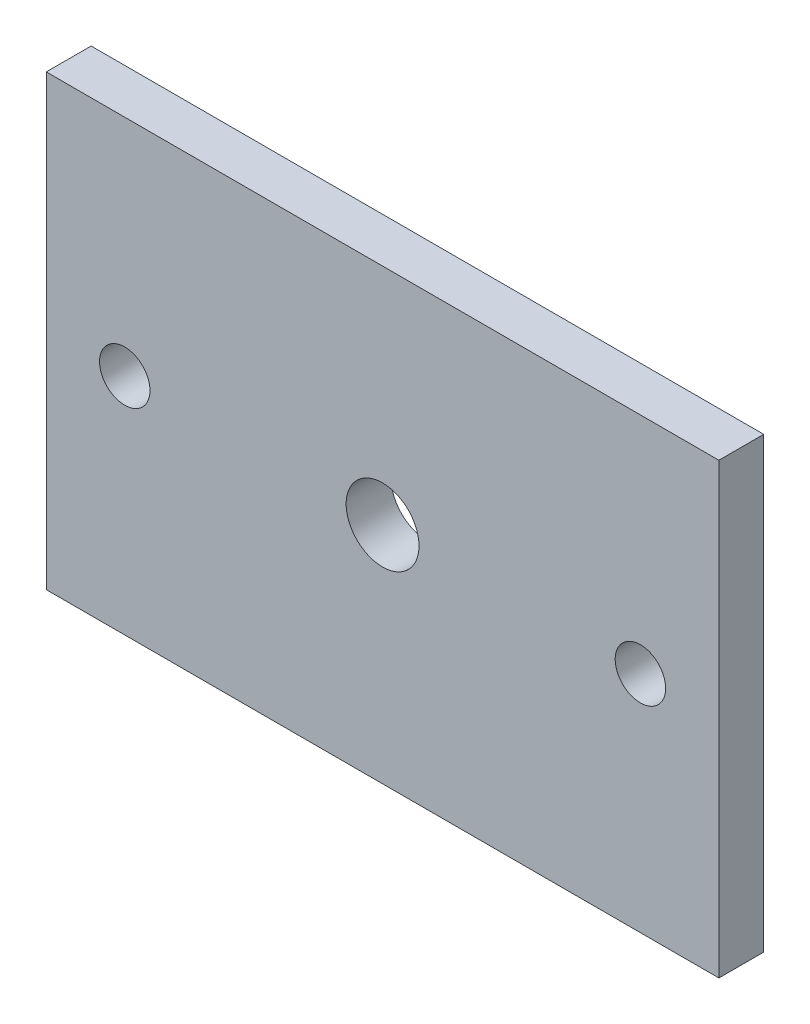
ISO-10303-21;
HEADER;
FILE_DESCRIPTION(('STEP AP214'),'2;1');
FILE_NAME('part.step','',(''),(''),'','','');
FILE_SCHEMA(('AUTOMOTIVE_DESIGN { 1 0 10303 214 1 1 1 1 }'));
ENDSEC;
DATA;
#1=APPLICATION_CONTEXT('core data for automotive mechanical design processes');
#2=APPLICATION_PROTOCOL_DEFINITION('international standard','automotive_design',2000,#1);
#3=PRODUCT_CONTEXT('',#1,'mechanical');
#4=PRODUCT('Part','Part','',(#3));
#5=PRODUCT_RELATED_PRODUCT_CATEGORY('part','',(#4));
#6=PRODUCT_DEFINITION_FORMATION('','',#4);
#7=PRODUCT_DEFINITION_CONTEXT('part definition',#1,'design');
#8=PRODUCT_DEFINITION('design','',#6,#7);
#9=PRODUCT_DEFINITION_SHAPE('','',#8);
#10=(LENGTH_UNIT() NAMED_UNIT(*) SI_UNIT(.MILLI.,.METRE.));
#11=(NAMED_UNIT(*) PLANE_ANGLE_UNIT() SI_UNIT($,.RADIAN.));
#12=(NAMED_UNIT(*) SI_UNIT($,.STERADIAN.) SOLID_ANGLE_UNIT());
#13=UNCERTAINTY_MEASURE_WITH_UNIT(LENGTH_MEASURE(1.E-05),#10,'distance_accuracy_value','');
#14=(GEOMETRIC_REPRESENTATION_CONTEXT(3) GLOBAL_UNCERTAINTY_ASSIGNED_CONTEXT((#13)) GLOBAL_UNIT_ASSIGNED_CONTEXT((#10,
#11,#12)) REPRESENTATION_CONTEXT('',''));
#15=CARTESIAN_POINT('',(0.,0.,0.));
#16=DIRECTION('',(0.,0.,1.));
#17=DIRECTION('',(1.,0.,0.));
#18=AXIS2_PLACEMENT_3D('',#15,#16,#17);
#19=CARTESIAN_POINT('',(23.,0.,-1.));
#20=DIRECTION('',(0.,0.,1.));
#21=DIRECTION('',(1.,0.,0.));
#22=AXIS2_PLACEMENT_3D('',#19,#20,#21);
#23=CYLINDRICAL_SURFACE('',#22,2.25);
#24=CARTESIAN_POINT('',(23.,0.,4.));
#25=DIRECTION('',(0.,0.,1.));
#26=DIRECTION('',(1.,0.,0.));
#27=AXIS2_PLACEMENT_3D('',#24,#25,#26);
#28=CIRCLE('',#27,2.25);
#29=CARTESIAN_POINT('',(25.25,0.,4.));
#30=VERTEX_POINT('',#29);
#31=EDGE_CURVE('E118',#30,#30,#28,.T.);
#32=ORIENTED_EDGE('',*,*,#31,.T.);
#33=EDGE_LOOP('',(#32));
#34=FACE_BOUND('',#33,.T.);
#35=CARTESIAN_POINT('',(23.,0.,0.));
#36=DIRECTION('',(0.,0.,1.));
#37=DIRECTION('',(1.,0.,0.));
#38=AXIS2_PLACEMENT_3D('',#35,#36,#37);
#39=CIRCLE('',#38,2.25);
#40=CARTESIAN_POINT('',(25.25,0.,0.));
#41=VERTEX_POINT('',#40);
#42=EDGE_CURVE('E10',#41,#41,#39,.T.);
#43=ORIENTED_EDGE('',*,*,#42,.F.);
#44=EDGE_LOOP('',(#43));
#45=FACE_BOUND('',#44,.T.);
#46=ADVANCED_FACE('F16',(#34,#45),#23,.F.);
#47=CARTESIAN_POINT('',(0.,0.,-1.));
#48=DIRECTION('',(0.,0.,1.));
#49=DIRECTION('',(1.,0.,0.));
#50=AXIS2_PLACEMENT_3D('',#47,#48,#49);
#51=CYLINDRICAL_SURFACE('',#50,3.25);
#52=CARTESIAN_POINT('',(0.,0.,4.));
#53=DIRECTION('',(0.,0.,1.));
#54=DIRECTION('',(1.,0.,0.));
#55=AXIS2_PLACEMENT_3D('',#52,#53,#54);
#56=CIRCLE('',#55,3.25);
#57=CARTESIAN_POINT('',(3.25,0.,4.));
#58=VERTEX_POINT('',#57);
#59=EDGE_CURVE('E114',#58,#58,#56,.T.);
#60=ORIENTED_EDGE('',*,*,#59,.T.);
#61=EDGE_LOOP('',(#60));
#62=FACE_BOUND('',#61,.T.);
#63=CARTESIAN_POINT('',(0.,0.,0.));
#64=DIRECTION('',(0.,0.,1.));
#65=DIRECTION('',(1.,0.,0.));
#66=AXIS2_PLACEMENT_3D('',#63,#64,#65);
#67=CIRCLE('',#66,3.25);
#68=CARTESIAN_POINT('',(3.25,0.,0.));
#69=VERTEX_POINT('',#68);
#70=EDGE_CURVE('E26',#69,#69,#67,.T.);
#71=ORIENTED_EDGE('',*,*,#70,.F.);
#72=EDGE_LOOP('',(#71));
#73=FACE_BOUND('',#72,.T.);
#74=ADVANCED_FACE('F18',(#62,#73),#51,.F.);
#75=CARTESIAN_POINT('',(-23.,0.,-1.));
#76=DIRECTION('',(0.,0.,1.));
#77=DIRECTION('',(1.,0.,0.));
#78=AXIS2_PLACEMENT_3D('',#75,#76,#77);
#79=CYLINDRICAL_SURFACE('',#78,2.25);
#80=CARTESIAN_POINT('',(-23.,0.,4.));
#81=DIRECTION('',(0.,0.,1.));
#82=DIRECTION('',(1.,0.,0.));
#83=AXIS2_PLACEMENT_3D('',#80,#81,#82);
#84=CIRCLE('',#83,2.25);
#85=CARTESIAN_POINT('',(-20.75,0.,4.));
#86=VERTEX_POINT('',#85);
#87=EDGE_CURVE('E113',#86,#86,#84,.T.);
#88=ORIENTED_EDGE('',*,*,#87,.T.);
#89=EDGE_LOOP('',(#88));
#90=FACE_BOUND('',#89,.T.);
#91=CARTESIAN_POINT('',(-23.,0.,0.));
#92=DIRECTION('',(0.,0.,1.));
#93=DIRECTION('',(1.,0.,0.));
#94=AXIS2_PLACEMENT_3D('',#91,#92,#93);
#95=CIRCLE('',#94,2.25);
#96=CARTESIAN_POINT('',(-20.75,0.,0.));
#97=VERTEX_POINT('',#96);
#98=EDGE_CURVE('E104',#97,#97,#95,.T.);
#99=ORIENTED_EDGE('',*,*,#98,.F.);
#100=EDGE_LOOP('',(#99));
#101=FACE_BOUND('',#100,.T.);
#102=ADVANCED_FACE('F144',(#90,#101),#79,.F.);
#103=CARTESIAN_POINT('',(30.,-20.,0.));
#104=DIRECTION('',(1.,0.,0.));
#105=DIRECTION('',(0.,1.,0.));
#106=AXIS2_PLACEMENT_3D('',#103,#104,#105);
#107=PLANE('',#106);
#108=DIRECTION('',(0.,0.,1.));
#109=VECTOR('',#108,1.);
#110=CARTESIAN_POINT('',(30.,-20.,0.));
#111=LINE('',#110,#109);
#112=CARTESIAN_POINT('',(30.,-20.,0.));
#113=VERTEX_POINT('',#112);
#114=CARTESIAN_POINT('',(30.,-20.,4.));
#115=VERTEX_POINT('',#114);
#116=EDGE_CURVE('E73',#113,#115,#111,.T.);
#117=ORIENTED_EDGE('',*,*,#116,.F.);
#118=DIRECTION('',(0.,1.,0.));
#119=VECTOR('',#118,1.);
#120=CARTESIAN_POINT('',(30.,-20.,0.));
#121=LINE('',#120,#119);
#122=CARTESIAN_POINT('',(30.,20.,0.));
#123=VERTEX_POINT('',#122);
#124=EDGE_CURVE('E37',#113,#123,#121,.T.);
#125=ORIENTED_EDGE('',*,*,#124,.T.);
#126=DIRECTION('',(0.,0.,1.));
#127=VECTOR('',#126,1.);
#128=CARTESIAN_POINT('',(30.,20.,0.));
#129=LINE('',#128,#127);
#130=CARTESIAN_POINT('',(30.,20.,4.));
#131=VERTEX_POINT('',#130);
#132=EDGE_CURVE('E105',#123,#131,#129,.T.);
#133=ORIENTED_EDGE('',*,*,#132,.T.);
#134=DIRECTION('',(0.,1.,0.));
#135=VECTOR('',#134,1.);
#136=CARTESIAN_POINT('',(30.,-20.,4.));
#137=LINE('',#136,#135);
#138=EDGE_CURVE('E110',#115,#131,#137,.T.);
#139=ORIENTED_EDGE('',*,*,#138,.F.);
#140=EDGE_LOOP('',(#117,#125,#133,#139));
#141=FACE_BOUND('',#140,.T.);
#142=ADVANCED_FACE('F151',(#141),#107,.T.);
#143=CARTESIAN_POINT('',(-30.,-20.,0.));
#144=DIRECTION('',(0.,0.,1.));
#145=DIRECTION('',(1.,0.,0.));
#146=AXIS2_PLACEMENT_3D('',#143,#144,#145);
#147=PLANE('',#146);
#148=ORIENTED_EDGE('',*,*,#42,.T.);
#149=EDGE_LOOP('',(#148));
#150=FACE_BOUND('',#149,.T.);
#151=ORIENTED_EDGE('',*,*,#70,.T.);
#152=EDGE_LOOP('',(#151));
#153=FACE_BOUND('',#152,.T.);
#154=ORIENTED_EDGE('',*,*,#98,.T.);
#155=EDGE_LOOP('',(#154));
#156=FACE_BOUND('',#155,.T.);
#157=DIRECTION('',(1.,0.,0.));
#158=VECTOR('',#157,1.);
#159=CARTESIAN_POINT('',(-30.,20.,0.));
#160=LINE('',#159,#158);
#161=CARTESIAN_POINT('',(-30.,20.,0.));
#162=VERTEX_POINT('',#161);
#163=EDGE_CURVE('E121',#162,#123,#160,.T.);
#164=ORIENTED_EDGE('',*,*,#163,.T.);
#165=ORIENTED_EDGE('',*,*,#124,.F.);
#166=DIRECTION('',(1.,0.,0.));
#167=VECTOR('',#166,1.);
#168=CARTESIAN_POINT('',(-30.,-20.,0.));
#169=LINE('',#168,#167);
#170=CARTESIAN_POINT('',(-30.,-20.,0.));
#171=VERTEX_POINT('',#170);
#172=EDGE_CURVE('E78',#171,#113,#169,.T.);
#173=ORIENTED_EDGE('',*,*,#172,.F.);
#174=DIRECTION('',(0.,1.,0.));
#175=VECTOR('',#174,1.);
#176=CARTESIAN_POINT('',(-30.,-20.,0.));
#177=LINE('',#176,#175);
#178=EDGE_CURVE('E86',#171,#162,#177,.T.);
#179=ORIENTED_EDGE('',*,*,#178,.T.);
#180=EDGE_LOOP('',(#164,#165,#173,#179));
#181=FACE_BOUND('',#180,.T.);
#182=ADVANCED_FACE('F140',(#150,#153,#156,#181),#147,.F.);
#183=CARTESIAN_POINT('',(-30.,20.,0.));
#184=DIRECTION('',(0.,1.,0.));
#185=DIRECTION('',(1.,0.,0.));
#186=AXIS2_PLACEMENT_3D('',#183,#184,#185);
#187=PLANE('',#186);
#188=ORIENTED_EDGE('',*,*,#163,.F.);
#189=DIRECTION('',(0.,0.,1.));
#190=VECTOR('',#189,1.);
#191=CARTESIAN_POINT('',(-30.,20.,0.));
#192=LINE('',#191,#190);
#193=CARTESIAN_POINT('',(-30.,20.,4.));
#194=VERTEX_POINT('',#193);
#195=EDGE_CURVE('E94',#162,#194,#192,.T.);
#196=ORIENTED_EDGE('',*,*,#195,.T.);
#197=DIRECTION('',(1.,0.,0.));
#198=VECTOR('',#197,1.);
#199=CARTESIAN_POINT('',(-30.,20.,4.));
#200=LINE('',#199,#198);
#201=EDGE_CURVE('E91',#194,#131,#200,.T.);
#202=ORIENTED_EDGE('',*,*,#201,.T.);
#203=ORIENTED_EDGE('',*,*,#132,.F.);
#204=EDGE_LOOP('',(#188,#196,#202,#203));
#205=FACE_BOUND('',#204,.T.);
#206=ADVANCED_FACE('F159',(#205),#187,.T.);
#207=CARTESIAN_POINT('',(-30.,-20.,4.));
#208=DIRECTION('',(0.,0.,1.));
#209=DIRECTION('',(1.,0.,0.));
#210=AXIS2_PLACEMENT_3D('',#207,#208,#209);
#211=PLANE('',#210);
#212=ORIENTED_EDGE('',*,*,#31,.F.);
#213=EDGE_LOOP('',(#212));
#214=FACE_BOUND('',#213,.T.);
#215=ORIENTED_EDGE('',*,*,#59,.F.);
#216=EDGE_LOOP('',(#215));
#217=FACE_BOUND('',#216,.T.);
#218=ORIENTED_EDGE('',*,*,#87,.F.);
#219=EDGE_LOOP('',(#218));
#220=FACE_BOUND('',#219,.T.);
#221=DIRECTION('',(0.,1.,0.));
#222=VECTOR('',#221,1.);
#223=CARTESIAN_POINT('',(-30.,-20.,4.));
#224=LINE('',#223,#222);
#225=CARTESIAN_POINT('',(-30.,-20.,4.));
#226=VERTEX_POINT('',#225);
#227=EDGE_CURVE('E84',#226,#194,#224,.T.);
#228=ORIENTED_EDGE('',*,*,#227,.F.);
#229=DIRECTION('',(1.,0.,0.));
#230=VECTOR('',#229,1.);
#231=CARTESIAN_POINT('',(-30.,-20.,4.));
#232=LINE('',#231,#230);
#233=EDGE_CURVE('E67',#226,#115,#232,.T.);
#234=ORIENTED_EDGE('',*,*,#233,.T.);
#235=ORIENTED_EDGE('',*,*,#138,.T.);
#236=ORIENTED_EDGE('',*,*,#201,.F.);
#237=EDGE_LOOP('',(#228,#234,#235,#236));
#238=FACE_BOUND('',#237,.T.);
#239=ADVANCED_FACE('F89',(#214,#217,#220,#238),#211,.T.);
#240=CARTESIAN_POINT('',(-30.,-20.,0.));
#241=DIRECTION('',(0.,1.,0.));
#242=DIRECTION('',(1.,0.,0.));
#243=AXIS2_PLACEMENT_3D('',#240,#241,#242);
#244=PLANE('',#243);
#245=ORIENTED_EDGE('',*,*,#116,.T.);
#246=ORIENTED_EDGE('',*,*,#233,.F.);
#247=DIRECTION('',(0.,0.,1.));
#248=VECTOR('',#247,1.);
#249=CARTESIAN_POINT('',(-30.,-20.,0.));
#250=LINE('',#249,#248);
#251=EDGE_CURVE('E71',#171,#226,#250,.T.);
#252=ORIENTED_EDGE('',*,*,#251,.F.);
#253=ORIENTED_EDGE('',*,*,#172,.T.);
#254=EDGE_LOOP('',(#245,#246,#252,#253));
#255=FACE_BOUND('',#254,.T.);
#256=ADVANCED_FACE('F69',(#255),#244,.F.);
#257=CARTESIAN_POINT('',(-30.,-20.,0.));
#258=DIRECTION('',(1.,0.,0.));
#259=DIRECTION('',(0.,1.,0.));
#260=AXIS2_PLACEMENT_3D('',#257,#258,#259);
#261=PLANE('',#260);
#262=ORIENTED_EDGE('',*,*,#227,.T.);
#263=ORIENTED_EDGE('',*,*,#195,.F.);
#264=ORIENTED_EDGE('',*,*,#178,.F.);
#265=ORIENTED_EDGE('',*,*,#251,.T.);
#266=EDGE_LOOP('',(#262,#263,#264,#265));
#267=FACE_BOUND('',#266,.T.);
#268=ADVANCED_FACE('F82',(#267),#261,.F.);
#269=CLOSED_SHELL('',(#46,#74,#102,#142,#182,#206,#239,#256,#268));
#270=MANIFOLD_SOLID_BREP('B1',#269);
#271=ADVANCED_BREP_SHAPE_REPRESENTATION('',(#18,#270),#14);
#272=SHAPE_DEFINITION_REPRESENTATION(#9,#271);
ENDSEC;
END-ISO-10303-21;
